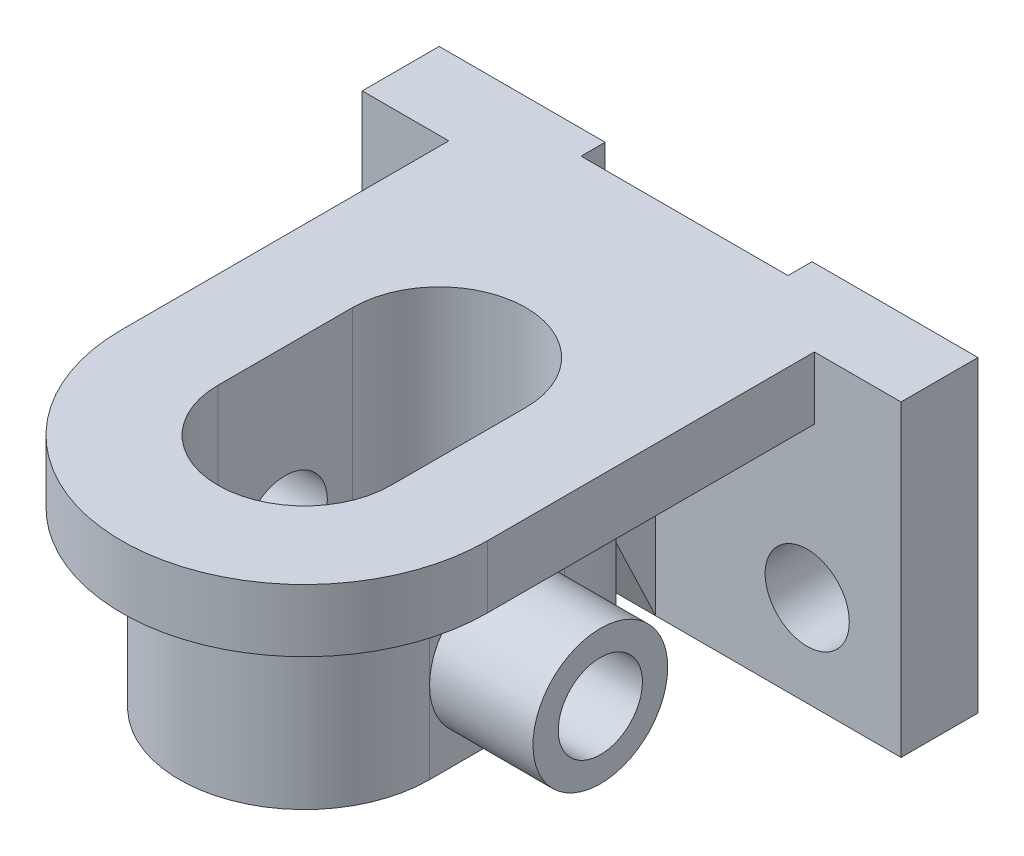
ISO-10303-21;
HEADER;
FILE_DESCRIPTION(('STEP AP214'),'2;1');
FILE_NAME('part.step','',(''),(''),'','','');
FILE_SCHEMA(('AUTOMOTIVE_DESIGN { 1 0 10303 214 1 1 1 1 }'));
ENDSEC;
DATA;
#1=APPLICATION_CONTEXT('core data for automotive mechanical design processes');
#2=APPLICATION_PROTOCOL_DEFINITION('international standard','automotive_design',2000,#1);
#3=PRODUCT_CONTEXT('',#1,'mechanical');
#4=PRODUCT('Part','Part','',(#3));
#5=PRODUCT_RELATED_PRODUCT_CATEGORY('part','',(#4));
#6=PRODUCT_DEFINITION_FORMATION('','',#4);
#7=PRODUCT_DEFINITION_CONTEXT('part definition',#1,'design');
#8=PRODUCT_DEFINITION('design','',#6,#7);
#9=PRODUCT_DEFINITION_SHAPE('','',#8);
#10=(LENGTH_UNIT() NAMED_UNIT(*) SI_UNIT(.MILLI.,.METRE.));
#11=(NAMED_UNIT(*) PLANE_ANGLE_UNIT() SI_UNIT($,.RADIAN.));
#12=(NAMED_UNIT(*) SI_UNIT($,.STERADIAN.) SOLID_ANGLE_UNIT());
#13=UNCERTAINTY_MEASURE_WITH_UNIT(LENGTH_MEASURE(1.E-05),#10,'distance_accuracy_value','');
#14=(GEOMETRIC_REPRESENTATION_CONTEXT(3) GLOBAL_UNCERTAINTY_ASSIGNED_CONTEXT((#13)) GLOBAL_UNIT_ASSIGNED_CONTEXT((#10,
#11,#12)) REPRESENTATION_CONTEXT('',''));
#15=CARTESIAN_POINT('',(0.,0.,0.));
#16=DIRECTION('',(0.,0.,1.));
#17=DIRECTION('',(1.,0.,0.));
#18=AXIS2_PLACEMENT_3D('',#15,#16,#17);
#19=CARTESIAN_POINT('',(0.,0.,32.));
#20=DIRECTION('',(0.,0.,1.));
#21=DIRECTION('',(1.,0.,0.));
#22=AXIS2_PLACEMENT_3D('',#19,#20,#21);
#23=PLANE('',#22);
#24=CARTESIAN_POINT('',(73.,-26.,32.));
#25=DIRECTION('',(0.,0.,1.));
#26=DIRECTION('',(1.,0.,0.));
#27=AXIS2_PLACEMENT_3D('',#24,#25,#26);
#28=CIRCLE('',#27,17.5);
#29=CARTESIAN_POINT('',(90.5,-26.,32.));
#30=VERTEX_POINT('',#29);
#31=EDGE_CURVE('E467',#30,#30,#28,.T.);
#32=ORIENTED_EDGE('',*,*,#31,.F.);
#33=EDGE_LOOP('',(#32));
#34=FACE_BOUND('',#33,.T.);
#35=DIRECTION('',(-1.,0.,0.));
#36=VECTOR('',#35,1.);
#37=CARTESIAN_POINT('',(76.,38.,32.));
#38=LINE('',#37,#36);
#39=CARTESIAN_POINT('',(76.,38.,32.));
#40=VERTEX_POINT('',#39);
#41=CARTESIAN_POINT('',(9.99999999999999,38.,32.));
#42=VERTEX_POINT('',#41);
#43=EDGE_CURVE('E407',#40,#42,#38,.T.);
#44=ORIENTED_EDGE('',*,*,#43,.T.);
#45=DIRECTION('',(0.,1.,0.));
#46=VECTOR('',#45,1.);
#47=CARTESIAN_POINT('',(10.,38.,32.));
#48=LINE('',#47,#46);
#49=CARTESIAN_POINT('',(9.99999999999999,-64.,32.));
#50=VERTEX_POINT('',#49);
#51=EDGE_CURVE('E252',#50,#42,#48,.T.);
#52=ORIENTED_EDGE('',*,*,#51,.F.);
#53=DIRECTION('',(1.,0.,0.));
#54=VECTOR('',#53,1.);
#55=CARTESIAN_POINT('',(112.,-64.,32.));
#56=LINE('',#55,#54);
#57=CARTESIAN_POINT('',(112.,-64.,32.));
#58=VERTEX_POINT('',#57);
#59=EDGE_CURVE('E479',#50,#58,#56,.T.);
#60=ORIENTED_EDGE('',*,*,#59,.T.);
#61=DIRECTION('',(0.,1.,0.));
#62=VECTOR('',#61,1.);
#63=CARTESIAN_POINT('',(112.,-64.,32.));
#64=LINE('',#63,#62);
#65=CARTESIAN_POINT('',(112.,64.,32.));
#66=VERTEX_POINT('',#65);
#67=EDGE_CURVE('E484',#58,#66,#64,.T.);
#68=ORIENTED_EDGE('',*,*,#67,.T.);
#69=DIRECTION('',(-1.,0.,0.));
#70=VECTOR('',#69,1.);
#71=CARTESIAN_POINT('',(112.,64.,32.));
#72=LINE('',#71,#70);
#73=CARTESIAN_POINT('',(76.,64.,32.));
#74=VERTEX_POINT('',#73);
#75=EDGE_CURVE('E488',#66,#74,#72,.T.);
#76=ORIENTED_EDGE('',*,*,#75,.T.);
#77=DIRECTION('',(0.,1.,0.));
#78=VECTOR('',#77,1.);
#79=CARTESIAN_POINT('',(76.,38.,32.));
#80=LINE('',#79,#78);
#81=EDGE_CURVE('E426',#40,#74,#80,.T.);
#82=ORIENTED_EDGE('',*,*,#81,.F.);
#83=EDGE_LOOP('',(#44,#52,#60,#68,#76,#82));
#84=FACE_BOUND('',#83,.T.);
#85=ADVANCED_FACE('F43',(#34,#84),#23,.T.);
#86=CARTESIAN_POINT('',(52.,-34.,112.));
#87=DIRECTION('',(-1.,0.,0.));
#88=DIRECTION('',(0.,-1.,0.));
#89=AXIS2_PLACEMENT_3D('',#86,#87,#88);
#90=PLANE('',#89);
#91=CARTESIAN_POINT('',(52.,0.,140.));
#92=DIRECTION('',(-1.,0.,0.));
#93=DIRECTION('',(0.,-1.,0.));
#94=AXIS2_PLACEMENT_3D('',#91,#92,#93);
#95=CIRCLE('',#94,28.);
#96=CARTESIAN_POINT('',(52.,0.,112.));
#97=VERTEX_POINT('',#96);
#98=CARTESIAN_POINT('',(52.,0.,168.));
#99=VERTEX_POINT('',#98);
#100=EDGE_CURVE('E535',#97,#99,#95,.F.);
#101=ORIENTED_EDGE('',*,*,#100,.F.);
#102=DIRECTION('',(0.,1.,0.));
#103=VECTOR('',#102,1.);
#104=CARTESIAN_POINT('',(52.,-34.,112.));
#105=LINE('',#104,#103);
#106=CARTESIAN_POINT('',(52.,38.,112.));
#107=VERTEX_POINT('',#106);
#108=EDGE_CURVE('E380',#97,#107,#105,.T.);
#109=ORIENTED_EDGE('',*,*,#108,.T.);
#110=DIRECTION('',(0.,0.,1.));
#111=VECTOR('',#110,1.);
#112=CARTESIAN_POINT('',(52.,38.,112.));
#113=LINE('',#112,#111);
#114=CARTESIAN_POINT('',(52.,38.,168.));
#115=VERTEX_POINT('',#114);
#116=EDGE_CURVE('E351',#107,#115,#113,.T.);
#117=ORIENTED_EDGE('',*,*,#116,.T.);
#118=DIRECTION('',(0.,1.,0.));
#119=VECTOR('',#118,1.);
#120=CARTESIAN_POINT('',(52.,-34.,168.));
#121=LINE('',#120,#119);
#122=EDGE_CURVE('E360',#99,#115,#121,.T.);
#123=ORIENTED_EDGE('',*,*,#122,.F.);
#124=EDGE_LOOP('',(#101,#109,#117,#123));
#125=FACE_BOUND('',#124,.T.);
#126=ADVANCED_FACE('F716',(#125),#90,.F.);
#127=CARTESIAN_POINT('',(-52.,-34.,168.));
#128=DIRECTION('',(1.,0.,0.));
#129=DIRECTION('',(0.,1.,0.));
#130=AXIS2_PLACEMENT_3D('',#127,#128,#129);
#131=PLANE('',#130);
#132=CARTESIAN_POINT('',(-52.,0.,140.));
#133=DIRECTION('',(-1.,0.,0.));
#134=DIRECTION('',(0.,-1.,0.));
#135=AXIS2_PLACEMENT_3D('',#132,#133,#134);
#136=CIRCLE('',#135,28.);
#137=CARTESIAN_POINT('',(-52.,0.,112.));
#138=VERTEX_POINT('',#137);
#139=CARTESIAN_POINT('',(-52.,0.,168.));
#140=VERTEX_POINT('',#139);
#141=EDGE_CURVE('E289',#138,#140,#136,.T.);
#142=ORIENTED_EDGE('',*,*,#141,.F.);
#143=DIRECTION('',(0.,1.,0.));
#144=VECTOR('',#143,1.);
#145=CARTESIAN_POINT('',(-52.,-34.,112.));
#146=LINE('',#145,#144);
#147=CARTESIAN_POINT('',(-52.,-34.,112.));
#148=VERTEX_POINT('',#147);
#149=EDGE_CURVE('E385',#148,#138,#146,.T.);
#150=ORIENTED_EDGE('',*,*,#149,.F.);
#151=DIRECTION('',(0.,0.,-1.));
#152=VECTOR('',#151,1.);
#153=CARTESIAN_POINT('',(-52.,-34.,168.));
#154=LINE('',#153,#152);
#155=CARTESIAN_POINT('',(-52.,-34.,168.));
#156=VERTEX_POINT('',#155);
#157=EDGE_CURVE('E350',#156,#148,#154,.T.);
#158=ORIENTED_EDGE('',*,*,#157,.F.);
#159=DIRECTION('',(0.,1.,0.));
#160=VECTOR('',#159,1.);
#161=CARTESIAN_POINT('',(-52.,-34.,168.));
#162=LINE('',#161,#160);
#163=EDGE_CURVE('E389',#156,#140,#162,.T.);
#164=ORIENTED_EDGE('',*,*,#163,.T.);
#165=EDGE_LOOP('',(#142,#150,#158,#164));
#166=FACE_BOUND('',#165,.T.);
#167=ADVANCED_FACE('F615',(#166),#131,.F.);
#168=CARTESIAN_POINT('',(0.,38.,168.));
#169=DIRECTION('',(0.,1.,0.));
#170=DIRECTION('',(-1.,0.,0.));
#171=AXIS2_PLACEMENT_3D('',#168,#169,#170);
#172=PLANE('',#171);
#173=CARTESIAN_POINT('',(-9.99999999999999,38.,32.));
#174=VERTEX_POINT('',#173);
#175=CARTESIAN_POINT('',(-76.,38.,32.));
#176=VERTEX_POINT('',#175);
#177=EDGE_CURVE('E406',#174,#176,#38,.T.);
#178=ORIENTED_EDGE('',*,*,#177,.F.);
#179=DIRECTION('',(0.,0.,1.));
#180=VECTOR('',#179,1.);
#181=CARTESIAN_POINT('',(-10.,38.,67.6370331222623));
#182=LINE('',#181,#180);
#183=CARTESIAN_POINT('',(-10.,38.,60.9705967113077));
#184=VERTEX_POINT('',#183);
#185=EDGE_CURVE('E247',#174,#184,#182,.T.);
#186=ORIENTED_EDGE('',*,*,#185,.T.);
#187=CARTESIAN_POINT('',(0.,38.,112.));
#188=DIRECTION('',(0.,-1.,0.));
#189=DIRECTION('',(1.,0.,0.));
#190=AXIS2_PLACEMENT_3D('',#187,#188,#189);
#191=CIRCLE('',#190,52.);
#192=CARTESIAN_POINT('',(-52.,38.,112.));
#193=VERTEX_POINT('',#192);
#194=EDGE_CURVE('E369',#193,#184,#191,.T.);
#195=ORIENTED_EDGE('',*,*,#194,.F.);
#196=DIRECTION('',(0.,0.,-1.));
#197=VECTOR('',#196,1.);
#198=CARTESIAN_POINT('',(-52.,38.,168.));
#199=LINE('',#198,#197);
#200=CARTESIAN_POINT('',(-52.,38.,168.));
#201=VERTEX_POINT('',#200);
#202=EDGE_CURVE('E364',#201,#193,#199,.T.);
#203=ORIENTED_EDGE('',*,*,#202,.F.);
#204=CARTESIAN_POINT('',(0.,38.,168.));
#205=DIRECTION('',(0.,-1.,0.));
#206=DIRECTION('',(-1.,0.,0.));
#207=AXIS2_PLACEMENT_3D('',#204,#205,#206);
#208=CIRCLE('',#207,52.);
#209=EDGE_CURVE('E345',#115,#201,#208,.T.);
#210=ORIENTED_EDGE('',*,*,#209,.F.);
#211=ORIENTED_EDGE('',*,*,#116,.F.);
#212=CARTESIAN_POINT('',(9.99999999999999,38.,60.9705967113077));
#213=VERTEX_POINT('',#212);
#214=EDGE_CURVE('E368',#213,#107,#191,.T.);
#215=ORIENTED_EDGE('',*,*,#214,.F.);
#216=DIRECTION('',(0.,0.,1.));
#217=VECTOR('',#216,1.);
#218=CARTESIAN_POINT('',(10.,38.,67.6370331222623));
#219=LINE('',#218,#217);
#220=EDGE_CURVE('E67',#42,#213,#219,.T.);
#221=ORIENTED_EDGE('',*,*,#220,.F.);
#222=ORIENTED_EDGE('',*,*,#43,.F.);
#223=DIRECTION('',(0.,0.,-1.));
#224=VECTOR('',#223,1.);
#225=CARTESIAN_POINT('',(76.,38.,168.));
#226=LINE('',#225,#224);
#227=CARTESIAN_POINT('',(76.,38.,168.));
#228=VERTEX_POINT('',#227);
#229=EDGE_CURVE('E403',#228,#40,#226,.T.);
#230=ORIENTED_EDGE('',*,*,#229,.F.);
#231=CARTESIAN_POINT('',(0.,38.,168.));
#232=DIRECTION('',(0.,1.,0.));
#233=DIRECTION('',(-1.,0.,0.));
#234=AXIS2_PLACEMENT_3D('',#231,#232,#233);
#235=CIRCLE('',#234,76.);
#236=CARTESIAN_POINT('',(-76.,38.,168.));
#237=VERTEX_POINT('',#236);
#238=EDGE_CURVE('E398',#237,#228,#235,.T.);
#239=ORIENTED_EDGE('',*,*,#238,.F.);
#240=DIRECTION('',(0.,0.,1.));
#241=VECTOR('',#240,1.);
#242=CARTESIAN_POINT('',(-76.,38.,168.));
#243=LINE('',#242,#241);
#244=EDGE_CURVE('E394',#176,#237,#243,.T.);
#245=ORIENTED_EDGE('',*,*,#244,.F.);
#246=EDGE_LOOP('',(#178,#186,#195,#203,#210,#211,#215,#221,#222,#230,#239,#245));
#247=FACE_BOUND('',#246,.T.);
#248=ADVANCED_FACE('F552',(#247),#172,.F.);
#249=CARTESIAN_POINT('',(0.,0.,0.));
#250=DIRECTION('',(0.,0.,1.));
#251=DIRECTION('',(1.,0.,0.));
#252=AXIS2_PLACEMENT_3D('',#249,#250,#251);
#253=PLANE('',#252);
#254=CARTESIAN_POINT('',(-73.,-26.,0.));
#255=DIRECTION('',(0.,0.,1.));
#256=DIRECTION('',(-1.,0.,0.));
#257=AXIS2_PLACEMENT_3D('',#254,#255,#256);
#258=CIRCLE('',#257,17.5);
#259=CARTESIAN_POINT('',(-90.5,-26.,0.));
#260=VERTEX_POINT('',#259);
#261=EDGE_CURVE('E458',#260,#260,#258,.T.);
#262=ORIENTED_EDGE('',*,*,#261,.T.);
#263=EDGE_LOOP('',(#262));
#264=FACE_BOUND('',#263,.T.);
#265=DIRECTION('',(-1.,0.,0.));
#266=VECTOR('',#265,1.);
#267=CARTESIAN_POINT('',(112.,64.,0.));
#268=LINE('',#267,#266);
#269=CARTESIAN_POINT('',(-43.,64.,0.));
#270=VERTEX_POINT('',#269);
#271=CARTESIAN_POINT('',(-112.,64.,0.));
#272=VERTEX_POINT('',#271);
#273=EDGE_CURVE('E504',#270,#272,#268,.T.);
#274=ORIENTED_EDGE('',*,*,#273,.F.);
#275=DIRECTION('',(0.,-1.,0.));
#276=VECTOR('',#275,1.);
#277=CARTESIAN_POINT('',(-43.,0.,0.));
#278=LINE('',#277,#276);
#279=CARTESIAN_POINT('',(-43.,-64.,0.));
#280=VERTEX_POINT('',#279);
#281=EDGE_CURVE('E454',#270,#280,#278,.T.);
#282=ORIENTED_EDGE('',*,*,#281,.T.);
#283=DIRECTION('',(1.,0.,0.));
#284=VECTOR('',#283,1.);
#285=CARTESIAN_POINT('',(112.,-64.,0.));
#286=LINE('',#285,#284);
#287=CARTESIAN_POINT('',(-112.,-64.,0.));
#288=VERTEX_POINT('',#287);
#289=EDGE_CURVE('E497',#288,#280,#286,.T.);
#290=ORIENTED_EDGE('',*,*,#289,.F.);
#291=DIRECTION('',(0.,-1.,0.));
#292=VECTOR('',#291,1.);
#293=CARTESIAN_POINT('',(-112.,-64.,0.));
#294=LINE('',#293,#292);
#295=EDGE_CURVE('E471',#272,#288,#294,.T.);
#296=ORIENTED_EDGE('',*,*,#295,.F.);
#297=EDGE_LOOP('',(#274,#282,#290,#296));
#298=FACE_BOUND('',#297,.T.);
#299=ADVANCED_FACE('F732',(#264,#298),#253,.F.);
#300=DIRECTION('',(0.,1.,0.));
#301=VECTOR('',#300,1.);
#302=CARTESIAN_POINT('',(-10.,38.,32.));
#303=LINE('',#302,#301);
#304=CARTESIAN_POINT('',(-9.99999999999999,-64.,32.));
#305=VERTEX_POINT('',#304);
#306=EDGE_CURVE('E59',#305,#174,#303,.T.);
#307=ORIENTED_EDGE('',*,*,#306,.T.);
#308=ORIENTED_EDGE('',*,*,#177,.T.);
#309=DIRECTION('',(0.,1.,0.));
#310=VECTOR('',#309,1.);
#311=CARTESIAN_POINT('',(-76.,38.,32.));
#312=LINE('',#311,#310);
#313=CARTESIAN_POINT('',(-76.,64.,32.));
#314=VERTEX_POINT('',#313);
#315=EDGE_CURVE('E421',#176,#314,#312,.T.);
#316=ORIENTED_EDGE('',*,*,#315,.T.);
#317=CARTESIAN_POINT('',(-112.,64.,32.));
#318=VERTEX_POINT('',#317);
#319=EDGE_CURVE('E487',#314,#318,#72,.T.);
#320=ORIENTED_EDGE('',*,*,#319,.T.);
#321=DIRECTION('',(0.,-1.,0.));
#322=VECTOR('',#321,1.);
#323=CARTESIAN_POINT('',(-112.,-64.,32.));
#324=LINE('',#323,#322);
#325=CARTESIAN_POINT('',(-112.,-64.,32.));
#326=VERTEX_POINT('',#325);
#327=EDGE_CURVE('E475',#318,#326,#324,.T.);
#328=ORIENTED_EDGE('',*,*,#327,.T.);
#329=EDGE_CURVE('E481',#326,#305,#56,.T.);
#330=ORIENTED_EDGE('',*,*,#329,.T.);
#331=EDGE_LOOP('',(#307,#308,#316,#320,#328,#330));
#332=FACE_BOUND('',#331,.T.);
#333=CARTESIAN_POINT('',(-73.,-26.,32.));
#334=DIRECTION('',(0.,0.,1.));
#335=DIRECTION('',(-1.,0.,0.));
#336=AXIS2_PLACEMENT_3D('',#333,#334,#335);
#337=CIRCLE('',#336,17.5);
#338=CARTESIAN_POINT('',(-90.5,-26.,32.));
#339=VERTEX_POINT('',#338);
#340=EDGE_CURVE('E459',#339,#339,#337,.T.);
#341=ORIENTED_EDGE('',*,*,#340,.F.);
#342=EDGE_LOOP('',(#341));
#343=FACE_BOUND('',#342,.T.);
#344=ADVANCED_FACE('F675',(#332,#343),#23,.T.);
#345=CARTESIAN_POINT('',(43.,-64.,0.));
#346=VERTEX_POINT('',#345);
#347=CARTESIAN_POINT('',(112.,-64.,0.));
#348=VERTEX_POINT('',#347);
#349=EDGE_CURVE('E496',#346,#348,#286,.T.);
#350=ORIENTED_EDGE('',*,*,#349,.F.);
#351=DIRECTION('',(0.,1.,0.));
#352=VECTOR('',#351,1.);
#353=CARTESIAN_POINT('',(43.,0.,0.));
#354=LINE('',#353,#352);
#355=CARTESIAN_POINT('',(43.,64.,0.));
#356=VERTEX_POINT('',#355);
#357=EDGE_CURVE('E448',#346,#356,#354,.T.);
#358=ORIENTED_EDGE('',*,*,#357,.T.);
#359=CARTESIAN_POINT('',(112.,64.,0.));
#360=VERTEX_POINT('',#359);
#361=EDGE_CURVE('E480',#360,#356,#268,.T.);
#362=ORIENTED_EDGE('',*,*,#361,.F.);
#363=DIRECTION('',(0.,1.,0.));
#364=VECTOR('',#363,1.);
#365=CARTESIAN_POINT('',(112.,-64.,0.));
#366=LINE('',#365,#364);
#367=EDGE_CURVE('E501',#348,#360,#366,.T.);
#368=ORIENTED_EDGE('',*,*,#367,.F.);
#369=EDGE_LOOP('',(#350,#358,#362,#368));
#370=FACE_BOUND('',#369,.T.);
#371=CARTESIAN_POINT('',(73.,-26.,0.));
#372=DIRECTION('',(0.,0.,1.));
#373=DIRECTION('',(1.,0.,0.));
#374=AXIS2_PLACEMENT_3D('',#371,#372,#373);
#375=CIRCLE('',#374,17.5);
#376=CARTESIAN_POINT('',(90.5,-26.,0.));
#377=VERTEX_POINT('',#376);
#378=EDGE_CURVE('E463',#377,#377,#375,.T.);
#379=ORIENTED_EDGE('',*,*,#378,.T.);
#380=EDGE_LOOP('',(#379));
#381=FACE_BOUND('',#380,.T.);
#382=ADVANCED_FACE('F731',(#370,#381),#253,.F.);
#383=CARTESIAN_POINT('',(-112.,-64.,32.));
#384=DIRECTION('',(1.,0.,0.));
#385=DIRECTION('',(0.,0.,-1.));
#386=AXIS2_PLACEMENT_3D('',#383,#384,#385);
#387=PLANE('',#386);
#388=ORIENTED_EDGE('',*,*,#295,.T.);
#389=DIRECTION('',(0.,0.,-1.));
#390=VECTOR('',#389,1.);
#391=CARTESIAN_POINT('',(-112.,-64.,32.));
#392=LINE('',#391,#390);
#393=EDGE_CURVE('E519',#326,#288,#392,.T.);
#394=ORIENTED_EDGE('',*,*,#393,.F.);
#395=ORIENTED_EDGE('',*,*,#327,.F.);
#396=DIRECTION('',(0.,0.,-1.));
#397=VECTOR('',#396,1.);
#398=CARTESIAN_POINT('',(-112.,64.,32.));
#399=LINE('',#398,#397);
#400=EDGE_CURVE('E492',#318,#272,#399,.T.);
#401=ORIENTED_EDGE('',*,*,#400,.T.);
#402=EDGE_LOOP('',(#388,#394,#395,#401));
#403=FACE_BOUND('',#402,.T.);
#404=ADVANCED_FACE('F45',(#403),#387,.F.);
#405=CARTESIAN_POINT('',(112.,-64.,32.));
#406=DIRECTION('',(0.,1.,0.));
#407=DIRECTION('',(-1.,0.,0.));
#408=AXIS2_PLACEMENT_3D('',#405,#406,#407);
#409=PLANE('',#408);
#410=ORIENTED_EDGE('',*,*,#289,.T.);
#411=DIRECTION('',(0.,0.,-1.));
#412=VECTOR('',#411,1.);
#413=CARTESIAN_POINT('',(-43.,-64.,-10.));
#414=LINE('',#413,#412);
#415=CARTESIAN_POINT('',(-43.,-64.,9.99999999999999));
#416=VERTEX_POINT('',#415);
#417=EDGE_CURVE('E425',#416,#280,#414,.T.);
#418=ORIENTED_EDGE('',*,*,#417,.F.);
#419=DIRECTION('',(-1.,0.,0.));
#420=VECTOR('',#419,1.);
#421=CARTESIAN_POINT('',(43.,-64.,10.));
#422=LINE('',#421,#420);
#423=CARTESIAN_POINT('',(43.,-64.,10.));
#424=VERTEX_POINT('',#423);
#425=EDGE_CURVE('E440',#424,#416,#422,.T.);
#426=ORIENTED_EDGE('',*,*,#425,.F.);
#427=DIRECTION('',(0.,0.,1.));
#428=VECTOR('',#427,1.);
#429=CARTESIAN_POINT('',(43.,-64.,-10.));
#430=LINE('',#429,#428);
#431=EDGE_CURVE('E436',#346,#424,#430,.T.);
#432=ORIENTED_EDGE('',*,*,#431,.F.);
#433=ORIENTED_EDGE('',*,*,#349,.T.);
#434=DIRECTION('',(0.,0.,-1.));
#435=VECTOR('',#434,1.);
#436=CARTESIAN_POINT('',(112.,-64.,32.));
#437=LINE('',#436,#435);
#438=EDGE_CURVE('E515',#58,#348,#437,.T.);
#439=ORIENTED_EDGE('',*,*,#438,.F.);
#440=ORIENTED_EDGE('',*,*,#59,.F.);
#441=DIRECTION('',(1.,0.,0.));
#442=VECTOR('',#441,1.);
#443=CARTESIAN_POINT('',(-10.,-64.,32.));
#444=LINE('',#443,#442);
#445=EDGE_CURVE('E246',#305,#50,#444,.T.);
#446=ORIENTED_EDGE('',*,*,#445,.F.);
#447=ORIENTED_EDGE('',*,*,#329,.F.);
#448=ORIENTED_EDGE('',*,*,#393,.T.);
#449=EDGE_LOOP('',(#410,#418,#426,#432,#433,#439,#440,#446,#447,#448));
#450=FACE_BOUND('',#449,.T.);
#451=ADVANCED_FACE('F686',(#450),#409,.F.);
#452=CARTESIAN_POINT('',(112.,-64.,32.));
#453=DIRECTION('',(-1.,0.,0.));
#454=DIRECTION('',(0.,0.,1.));
#455=AXIS2_PLACEMENT_3D('',#452,#453,#454);
#456=PLANE('',#455);
#457=ORIENTED_EDGE('',*,*,#367,.T.);
#458=DIRECTION('',(0.,0.,-1.));
#459=VECTOR('',#458,1.);
#460=CARTESIAN_POINT('',(112.,64.,32.));
#461=LINE('',#460,#459);
#462=EDGE_CURVE('E511',#66,#360,#461,.T.);
#463=ORIENTED_EDGE('',*,*,#462,.F.);
#464=ORIENTED_EDGE('',*,*,#67,.F.);
#465=ORIENTED_EDGE('',*,*,#438,.T.);
#466=EDGE_LOOP('',(#457,#463,#464,#465));
#467=FACE_BOUND('',#466,.T.);
#468=ADVANCED_FACE('F748',(#467),#456,.F.);
#469=CARTESIAN_POINT('',(112.,64.,32.));
#470=DIRECTION('',(0.,-1.,0.));
#471=DIRECTION('',(1.,0.,0.));
#472=AXIS2_PLACEMENT_3D('',#469,#470,#471);
#473=PLANE('',#472);
#474=DIRECTION('',(0.,0.,1.));
#475=VECTOR('',#474,1.);
#476=CARTESIAN_POINT('',(36.,64.,32.));
#477=LINE('',#476,#475);
#478=CARTESIAN_POINT('',(36.,64.,112.));
#479=VERTEX_POINT('',#478);
#480=CARTESIAN_POINT('',(36.,64.,168.));
#481=VERTEX_POINT('',#480);
#482=EDGE_CURVE('E337',#479,#481,#477,.T.);
#483=ORIENTED_EDGE('',*,*,#482,.T.);
#484=CARTESIAN_POINT('',(0.,64.,168.));
#485=DIRECTION('',(0.,-1.,0.));
#486=DIRECTION('',(1.,0.,0.));
#487=AXIS2_PLACEMENT_3D('',#484,#485,#486);
#488=CIRCLE('',#487,36.);
#489=CARTESIAN_POINT('',(-36.,64.,168.));
#490=VERTEX_POINT('',#489);
#491=EDGE_CURVE('E341',#481,#490,#488,.T.);
#492=ORIENTED_EDGE('',*,*,#491,.T.);
#493=DIRECTION('',(0.,0.,-1.));
#494=VECTOR('',#493,1.);
#495=CARTESIAN_POINT('',(-36.,64.,32.));
#496=LINE('',#495,#494);
#497=CARTESIAN_POINT('',(-36.,64.,112.));
#498=VERTEX_POINT('',#497);
#499=EDGE_CURVE('E320',#490,#498,#496,.T.);
#500=ORIENTED_EDGE('',*,*,#499,.T.);
#501=CARTESIAN_POINT('',(0.,64.,112.));
#502=DIRECTION('',(0.,-1.,0.));
#503=DIRECTION('',(1.,0.,0.));
#504=AXIS2_PLACEMENT_3D('',#501,#502,#503);
#505=CIRCLE('',#504,36.);
#506=EDGE_CURVE('E333',#498,#479,#505,.T.);
#507=ORIENTED_EDGE('',*,*,#506,.T.);
#508=EDGE_LOOP('',(#483,#492,#500,#507));
#509=FACE_BOUND('',#508,.T.);
#510=DIRECTION('',(-1.,0.,0.));
#511=VECTOR('',#510,1.);
#512=CARTESIAN_POINT('',(112.,64.,10.));
#513=LINE('',#512,#511);
#514=CARTESIAN_POINT('',(43.,64.,10.));
#515=VERTEX_POINT('',#514);
#516=CARTESIAN_POINT('',(-43.,64.,9.99999999999999));
#517=VERTEX_POINT('',#516);
#518=EDGE_CURVE('E527',#515,#517,#513,.T.);
#519=ORIENTED_EDGE('',*,*,#518,.T.);
#520=DIRECTION('',(0.,0.,-1.));
#521=VECTOR('',#520,1.);
#522=CARTESIAN_POINT('',(-43.,64.,32.));
#523=LINE('',#522,#521);
#524=EDGE_CURVE('E531',#517,#270,#523,.T.);
#525=ORIENTED_EDGE('',*,*,#524,.T.);
#526=ORIENTED_EDGE('',*,*,#273,.T.);
#527=ORIENTED_EDGE('',*,*,#400,.F.);
#528=ORIENTED_EDGE('',*,*,#319,.F.);
#529=DIRECTION('',(0.,0.,1.));
#530=VECTOR('',#529,1.);
#531=CARTESIAN_POINT('',(-76.,64.,168.));
#532=LINE('',#531,#530);
#533=CARTESIAN_POINT('',(-76.,64.,168.));
#534=VERTEX_POINT('',#533);
#535=EDGE_CURVE('E393',#314,#534,#532,.T.);
#536=ORIENTED_EDGE('',*,*,#535,.T.);
#537=CARTESIAN_POINT('',(0.,64.,168.));
#538=DIRECTION('',(0.,1.,0.));
#539=DIRECTION('',(-1.,0.,0.));
#540=AXIS2_PLACEMENT_3D('',#537,#538,#539);
#541=CIRCLE('',#540,76.);
#542=CARTESIAN_POINT('',(76.,64.,168.));
#543=VERTEX_POINT('',#542);
#544=EDGE_CURVE('E414',#534,#543,#541,.T.);
#545=ORIENTED_EDGE('',*,*,#544,.T.);
#546=DIRECTION('',(0.,0.,-1.));
#547=VECTOR('',#546,1.);
#548=CARTESIAN_POINT('',(76.,64.,168.));
#549=LINE('',#548,#547);
#550=EDGE_CURVE('E399',#543,#74,#549,.T.);
#551=ORIENTED_EDGE('',*,*,#550,.T.);
#552=ORIENTED_EDGE('',*,*,#75,.F.);
#553=ORIENTED_EDGE('',*,*,#462,.T.);
#554=ORIENTED_EDGE('',*,*,#361,.T.);
#555=DIRECTION('',(0.,0.,1.));
#556=VECTOR('',#555,1.);
#557=CARTESIAN_POINT('',(43.,64.,32.));
#558=LINE('',#557,#556);
#559=EDGE_CURVE('E523',#356,#515,#558,.T.);
#560=ORIENTED_EDGE('',*,*,#559,.T.);
#561=EDGE_LOOP('',(#519,#525,#526,#527,#528,#536,#545,#551,#552,#553,#554,#560));
#562=FACE_BOUND('',#561,.T.);
#563=ADVANCED_FACE('F681',(#509,#562),#473,.F.);
#564=CARTESIAN_POINT('',(73.,-26.,32.));
#565=DIRECTION('',(0.,0.,-1.));
#566=DIRECTION('',(-1.,0.,0.));
#567=AXIS2_PLACEMENT_3D('',#564,#565,#566);
#568=CYLINDRICAL_SURFACE('',#567,17.5);
#569=ORIENTED_EDGE('',*,*,#31,.T.);
#570=EDGE_LOOP('',(#569));
#571=FACE_BOUND('',#570,.T.);
#572=ORIENTED_EDGE('',*,*,#378,.F.);
#573=EDGE_LOOP('',(#572));
#574=FACE_BOUND('',#573,.T.);
#575=ADVANCED_FACE('F747',(#571,#574),#568,.F.);
#576=CARTESIAN_POINT('',(-73.,-26.,32.));
#577=DIRECTION('',(0.,0.,-1.));
#578=DIRECTION('',(-1.,0.,0.));
#579=AXIS2_PLACEMENT_3D('',#576,#577,#578);
#580=CYLINDRICAL_SURFACE('',#579,17.5);
#581=ORIENTED_EDGE('',*,*,#340,.T.);
#582=EDGE_LOOP('',(#581));
#583=FACE_BOUND('',#582,.T.);
#584=ORIENTED_EDGE('',*,*,#261,.F.);
#585=EDGE_LOOP('',(#584));
#586=FACE_BOUND('',#585,.T.);
#587=ADVANCED_FACE('F771',(#583,#586),#580,.F.);
#588=CARTESIAN_POINT('',(-43.,81.,-10.));
#589=DIRECTION('',(-1.,0.,0.));
#590=DIRECTION('',(0.,-1.,0.));
#591=AXIS2_PLACEMENT_3D('',#588,#589,#590);
#592=PLANE('',#591);
#593=ORIENTED_EDGE('',*,*,#524,.F.);
#594=DIRECTION('',(0.,-1.,0.));
#595=VECTOR('',#594,1.);
#596=CARTESIAN_POINT('',(-43.,81.,9.99999999999999));
#597=LINE('',#596,#595);
#598=EDGE_CURVE('E445',#517,#416,#597,.T.);
#599=ORIENTED_EDGE('',*,*,#598,.T.);
#600=ORIENTED_EDGE('',*,*,#417,.T.);
#601=ORIENTED_EDGE('',*,*,#281,.F.);
#602=EDGE_LOOP('',(#593,#599,#600,#601));
#603=FACE_BOUND('',#602,.T.);
#604=ADVANCED_FACE('F778',(#603),#592,.F.);
#605=CARTESIAN_POINT('',(43.,81.,10.));
#606=DIRECTION('',(0.,0.,1.));
#607=DIRECTION('',(1.,0.,0.));
#608=AXIS2_PLACEMENT_3D('',#605,#606,#607);
#609=PLANE('',#608);
#610=DIRECTION('',(0.,-1.,0.));
#611=VECTOR('',#610,1.);
#612=CARTESIAN_POINT('',(43.,81.,10.));
#613=LINE('',#612,#611);
#614=EDGE_CURVE('E444',#515,#424,#613,.T.);
#615=ORIENTED_EDGE('',*,*,#614,.T.);
#616=ORIENTED_EDGE('',*,*,#425,.T.);
#617=ORIENTED_EDGE('',*,*,#598,.F.);
#618=ORIENTED_EDGE('',*,*,#518,.F.);
#619=EDGE_LOOP('',(#615,#616,#617,#618));
#620=FACE_BOUND('',#619,.T.);
#621=ADVANCED_FACE('F795',(#620),#609,.F.);
#622=CARTESIAN_POINT('',(43.,81.,-10.));
#623=DIRECTION('',(1.,0.,0.));
#624=DIRECTION('',(0.,1.,0.));
#625=AXIS2_PLACEMENT_3D('',#622,#623,#624);
#626=PLANE('',#625);
#627=ORIENTED_EDGE('',*,*,#431,.T.);
#628=ORIENTED_EDGE('',*,*,#614,.F.);
#629=ORIENTED_EDGE('',*,*,#559,.F.);
#630=ORIENTED_EDGE('',*,*,#357,.F.);
#631=EDGE_LOOP('',(#627,#628,#629,#630));
#632=FACE_BOUND('',#631,.T.);
#633=ADVANCED_FACE('F712',(#632),#626,.F.);
#634=CARTESIAN_POINT('',(-76.,38.,168.));
#635=DIRECTION('',(-1.,0.,0.));
#636=DIRECTION('',(0.,-1.,0.));
#637=AXIS2_PLACEMENT_3D('',#634,#635,#636);
#638=PLANE('',#637);
#639=ORIENTED_EDGE('',*,*,#535,.F.);
#640=ORIENTED_EDGE('',*,*,#315,.F.);
#641=ORIENTED_EDGE('',*,*,#244,.T.);
#642=DIRECTION('',(0.,1.,0.));
#643=VECTOR('',#642,1.);
#644=CARTESIAN_POINT('',(-76.,38.,168.));
#645=LINE('',#644,#643);
#646=EDGE_CURVE('E410',#237,#534,#645,.T.);
#647=ORIENTED_EDGE('',*,*,#646,.T.);
#648=EDGE_LOOP('',(#639,#640,#641,#647));
#649=FACE_BOUND('',#648,.T.);
#650=ADVANCED_FACE('F702',(#649),#638,.T.);
#651=CARTESIAN_POINT('',(76.,38.,168.));
#652=DIRECTION('',(1.,0.,0.));
#653=DIRECTION('',(0.,1.,0.));
#654=AXIS2_PLACEMENT_3D('',#651,#652,#653);
#655=PLANE('',#654);
#656=ORIENTED_EDGE('',*,*,#550,.F.);
#657=DIRECTION('',(0.,1.,0.));
#658=VECTOR('',#657,1.);
#659=CARTESIAN_POINT('',(76.,38.,168.));
#660=LINE('',#659,#658);
#661=EDGE_CURVE('E429',#228,#543,#660,.T.);
#662=ORIENTED_EDGE('',*,*,#661,.F.);
#663=ORIENTED_EDGE('',*,*,#229,.T.);
#664=ORIENTED_EDGE('',*,*,#81,.T.);
#665=EDGE_LOOP('',(#656,#662,#663,#664));
#666=FACE_BOUND('',#665,.T.);
#667=ADVANCED_FACE('F704',(#666),#655,.T.);
#668=CARTESIAN_POINT('',(0.,38.,168.));
#669=DIRECTION('',(0.,1.,0.));
#670=DIRECTION('',(-1.,0.,0.));
#671=AXIS2_PLACEMENT_3D('',#668,#669,#670);
#672=CYLINDRICAL_SURFACE('',#671,76.);
#673=ORIENTED_EDGE('',*,*,#544,.F.);
#674=ORIENTED_EDGE('',*,*,#646,.F.);
#675=ORIENTED_EDGE('',*,*,#238,.T.);
#676=ORIENTED_EDGE('',*,*,#661,.T.);
#677=EDGE_LOOP('',(#673,#674,#675,#676));
#678=FACE_BOUND('',#677,.T.);
#679=ADVANCED_FACE('F699',(#678),#672,.T.);
#680=CARTESIAN_POINT('',(0.,-34.,168.));
#681=DIRECTION('',(0.,1.,0.));
#682=DIRECTION('',(-1.,0.,0.));
#683=AXIS2_PLACEMENT_3D('',#680,#681,#682);
#684=CYLINDRICAL_SURFACE('',#683,52.);
#685=ORIENTED_EDGE('',*,*,#209,.T.);
#686=EDGE_CURVE('E388',#140,#201,#162,.T.);
#687=ORIENTED_EDGE('',*,*,#686,.F.);
#688=ORIENTED_EDGE('',*,*,#163,.F.);
#689=CARTESIAN_POINT('',(0.,-34.,168.));
#690=DIRECTION('',(0.,-1.,0.));
#691=DIRECTION('',(-1.,0.,0.));
#692=AXIS2_PLACEMENT_3D('',#689,#690,#691);
#693=CIRCLE('',#692,52.);
#694=CARTESIAN_POINT('',(52.,-34.,168.));
#695=VERTEX_POINT('',#694);
#696=EDGE_CURVE('E346',#695,#156,#693,.T.);
#697=ORIENTED_EDGE('',*,*,#696,.F.);
#698=EDGE_CURVE('E376',#695,#99,#121,.T.);
#699=ORIENTED_EDGE('',*,*,#698,.T.);
#700=ORIENTED_EDGE('',*,*,#122,.T.);
#701=EDGE_LOOP('',(#685,#687,#688,#697,#699,#700));
#702=FACE_BOUND('',#701,.T.);
#703=ADVANCED_FACE('F620',(#702),#684,.T.);
#704=EDGE_CURVE('E298',#140,#138,#136,.T.);
#705=ORIENTED_EDGE('',*,*,#704,.F.);
#706=ORIENTED_EDGE('',*,*,#686,.T.);
#707=ORIENTED_EDGE('',*,*,#202,.T.);
#708=EDGE_CURVE('E384',#138,#193,#146,.T.);
#709=ORIENTED_EDGE('',*,*,#708,.F.);
#710=EDGE_LOOP('',(#705,#706,#707,#709));
#711=FACE_BOUND('',#710,.T.);
#712=ADVANCED_FACE('F852',(#711),#131,.F.);
#713=CARTESIAN_POINT('',(0.,-34.,112.));
#714=DIRECTION('',(0.,1.,0.));
#715=DIRECTION('',(-1.,0.,0.));
#716=AXIS2_PLACEMENT_3D('',#713,#714,#715);
#717=CYLINDRICAL_SURFACE('',#716,52.);
#718=ORIENTED_EDGE('',*,*,#194,.T.);
#719=DIRECTION('',(0.,1.,0.));
#720=VECTOR('',#719,1.);
#721=CARTESIAN_POINT('',(-10.,-34.,60.9705967113077));
#722=LINE('',#721,#720);
#723=CARTESIAN_POINT('',(-10.,-22.,60.9705967113077));
#724=VERTEX_POINT('',#723);
#725=EDGE_CURVE('E11',#184,#724,#722,.F.);
#726=ORIENTED_EDGE('',*,*,#725,.T.);
#727=CARTESIAN_POINT('',(0.,-22.,112.));
#728=DIRECTION('',(0.,-1.,0.));
#729=DIRECTION('',(0.,0.,-1.));
#730=AXIS2_PLACEMENT_3D('',#727,#728,#729);
#731=CIRCLE('',#730,52.);
#732=CARTESIAN_POINT('',(10.,-22.,60.9705967113077));
#733=VERTEX_POINT('',#732);
#734=EDGE_CURVE('E52',#724,#733,#731,.T.);
#735=ORIENTED_EDGE('',*,*,#734,.T.);
#736=DIRECTION('',(0.,1.,0.));
#737=VECTOR('',#736,1.);
#738=CARTESIAN_POINT('',(10.,-34.,60.9705967113077));
#739=LINE('',#738,#737);
#740=EDGE_CURVE('E232',#213,#733,#739,.F.);
#741=ORIENTED_EDGE('',*,*,#740,.F.);
#742=ORIENTED_EDGE('',*,*,#214,.T.);
#743=ORIENTED_EDGE('',*,*,#108,.F.);
#744=CARTESIAN_POINT('',(52.,-34.,112.));
#745=VERTEX_POINT('',#744);
#746=EDGE_CURVE('E381',#745,#97,#105,.T.);
#747=ORIENTED_EDGE('',*,*,#746,.F.);
#748=CARTESIAN_POINT('',(0.,-34.,112.));
#749=DIRECTION('',(0.,-1.,0.));
#750=DIRECTION('',(1.,0.,0.));
#751=AXIS2_PLACEMENT_3D('',#748,#749,#750);
#752=CIRCLE('',#751,52.);
#753=EDGE_CURVE('E354',#148,#745,#752,.T.);
#754=ORIENTED_EDGE('',*,*,#753,.F.);
#755=ORIENTED_EDGE('',*,*,#149,.T.);
#756=ORIENTED_EDGE('',*,*,#708,.T.);
#757=EDGE_LOOP('',(#718,#726,#735,#741,#742,#743,#747,#754,#755,#756));
#758=FACE_BOUND('',#757,.T.);
#759=ADVANCED_FACE('F546',(#758),#717,.T.);
#760=CARTESIAN_POINT('',(52.,0.,140.));
#761=DIRECTION('',(1.,0.,0.));
#762=DIRECTION('',(0.,1.,0.));
#763=AXIS2_PLACEMENT_3D('',#760,#761,#762);
#764=CIRCLE('',#763,28.);
#765=EDGE_CURVE('E284',#99,#97,#764,.T.);
#766=ORIENTED_EDGE('',*,*,#765,.F.);
#767=ORIENTED_EDGE('',*,*,#698,.F.);
#768=DIRECTION('',(0.,0.,1.));
#769=VECTOR('',#768,1.);
#770=CARTESIAN_POINT('',(52.,-34.,112.));
#771=LINE('',#770,#769);
#772=EDGE_CURVE('E357',#745,#695,#771,.T.);
#773=ORIENTED_EDGE('',*,*,#772,.F.);
#774=ORIENTED_EDGE('',*,*,#746,.T.);
#775=EDGE_LOOP('',(#766,#767,#773,#774));
#776=FACE_BOUND('',#775,.T.);
#777=ADVANCED_FACE('F726',(#776),#90,.F.);
#778=CARTESIAN_POINT('',(0.,-34.,168.));
#779=DIRECTION('',(0.,1.,0.));
#780=DIRECTION('',(-1.,0.,0.));
#781=AXIS2_PLACEMENT_3D('',#778,#779,#780);
#782=PLANE('',#781);
#783=DIRECTION('',(0.,0.,-1.));
#784=VECTOR('',#783,1.);
#785=CARTESIAN_POINT('',(-36.,-34.,168.));
#786=LINE('',#785,#784);
#787=CARTESIAN_POINT('',(-36.,-34.,168.));
#788=VERTEX_POINT('',#787);
#789=CARTESIAN_POINT('',(-36.,-34.,112.));
#790=VERTEX_POINT('',#789);
#791=EDGE_CURVE('E304',#788,#790,#786,.T.);
#792=ORIENTED_EDGE('',*,*,#791,.F.);
#793=CARTESIAN_POINT('',(0.,-34.,168.));
#794=DIRECTION('',(0.,-1.,0.));
#795=DIRECTION('',(-1.,0.,0.));
#796=AXIS2_PLACEMENT_3D('',#793,#794,#795);
#797=CIRCLE('',#796,36.);
#798=CARTESIAN_POINT('',(36.,-34.,168.));
#799=VERTEX_POINT('',#798);
#800=EDGE_CURVE('E297',#799,#788,#797,.T.);
#801=ORIENTED_EDGE('',*,*,#800,.F.);
#802=DIRECTION('',(0.,0.,1.));
#803=VECTOR('',#802,1.);
#804=CARTESIAN_POINT('',(36.,-34.,112.));
#805=LINE('',#804,#803);
#806=CARTESIAN_POINT('',(36.,-34.,112.));
#807=VERTEX_POINT('',#806);
#808=EDGE_CURVE('E312',#807,#799,#805,.T.);
#809=ORIENTED_EDGE('',*,*,#808,.F.);
#810=CARTESIAN_POINT('',(0.,-34.,112.));
#811=DIRECTION('',(0.,-1.,0.));
#812=DIRECTION('',(1.,0.,0.));
#813=AXIS2_PLACEMENT_3D('',#810,#811,#812);
#814=CIRCLE('',#813,36.);
#815=EDGE_CURVE('E308',#790,#807,#814,.T.);
#816=ORIENTED_EDGE('',*,*,#815,.F.);
#817=EDGE_LOOP('',(#792,#801,#809,#816));
#818=FACE_BOUND('',#817,.T.);
#819=ORIENTED_EDGE('',*,*,#696,.T.);
#820=ORIENTED_EDGE('',*,*,#157,.T.);
#821=ORIENTED_EDGE('',*,*,#753,.T.);
#822=ORIENTED_EDGE('',*,*,#772,.T.);
#823=EDGE_LOOP('',(#819,#820,#821,#822));
#824=FACE_BOUND('',#823,.T.);
#825=ADVANCED_FACE('F879',(#818,#824),#782,.F.);
#826=CARTESIAN_POINT('',(0.,97.0000000000001,168.));
#827=DIRECTION('',(0.,-1.,0.));
#828=DIRECTION('',(1.,0.,0.));
#829=AXIS2_PLACEMENT_3D('',#826,#827,#828);
#830=CYLINDRICAL_SURFACE('',#829,36.);
#831=DIRECTION('',(0.,-1.,0.));
#832=VECTOR('',#831,1.);
#833=CARTESIAN_POINT('',(36.,97.0000000000001,168.));
#834=LINE('',#833,#832);
#835=EDGE_CURVE('E317',#481,#799,#834,.T.);
#836=ORIENTED_EDGE('',*,*,#835,.T.);
#837=ORIENTED_EDGE('',*,*,#800,.T.);
#838=DIRECTION('',(0.,-1.,0.));
#839=VECTOR('',#838,1.);
#840=CARTESIAN_POINT('',(-36.,97.0000000000001,168.));
#841=LINE('',#840,#839);
#842=EDGE_CURVE('E316',#490,#788,#841,.T.);
#843=ORIENTED_EDGE('',*,*,#842,.F.);
#844=ORIENTED_EDGE('',*,*,#491,.F.);
#845=EDGE_LOOP('',(#836,#837,#843,#844));
#846=FACE_BOUND('',#845,.T.);
#847=ADVANCED_FACE('F888',(#846),#830,.F.);
#848=CARTESIAN_POINT('',(36.,97.0000000000001,112.));
#849=DIRECTION('',(1.,0.,0.));
#850=DIRECTION('',(0.,1.,0.));
#851=AXIS2_PLACEMENT_3D('',#848,#849,#850);
#852=PLANE('',#851);
#853=CARTESIAN_POINT('',(36.,0.,140.));
#854=DIRECTION('',(1.,0.,0.));
#855=DIRECTION('',(0.,1.,0.));
#856=AXIS2_PLACEMENT_3D('',#853,#854,#855);
#857=CIRCLE('',#856,17.5);
#858=CARTESIAN_POINT('',(36.,17.5,140.));
#859=VERTEX_POINT('',#858);
#860=EDGE_CURVE('E280',#859,#859,#857,.T.);
#861=ORIENTED_EDGE('',*,*,#860,.T.);
#862=EDGE_LOOP('',(#861));
#863=FACE_BOUND('',#862,.T.);
#864=DIRECTION('',(0.,-1.,0.));
#865=VECTOR('',#864,1.);
#866=CARTESIAN_POINT('',(36.,97.0000000000001,112.));
#867=LINE('',#866,#865);
#868=EDGE_CURVE('E321',#479,#807,#867,.T.);
#869=ORIENTED_EDGE('',*,*,#868,.T.);
#870=ORIENTED_EDGE('',*,*,#808,.T.);
#871=ORIENTED_EDGE('',*,*,#835,.F.);
#872=ORIENTED_EDGE('',*,*,#482,.F.);
#873=EDGE_LOOP('',(#869,#870,#871,#872));
#874=FACE_BOUND('',#873,.T.);
#875=ADVANCED_FACE('F898',(#863,#874),#852,.F.);
#876=CARTESIAN_POINT('',(0.,97.0000000000001,112.));
#877=DIRECTION('',(0.,-1.,0.));
#878=DIRECTION('',(1.,0.,0.));
#879=AXIS2_PLACEMENT_3D('',#876,#877,#878);
#880=CYLINDRICAL_SURFACE('',#879,36.);
#881=DIRECTION('',(0.,-1.,0.));
#882=VECTOR('',#881,1.);
#883=CARTESIAN_POINT('',(-36.,97.0000000000001,112.));
#884=LINE('',#883,#882);
#885=EDGE_CURVE('E324',#498,#790,#884,.T.);
#886=ORIENTED_EDGE('',*,*,#885,.T.);
#887=ORIENTED_EDGE('',*,*,#815,.T.);
#888=ORIENTED_EDGE('',*,*,#868,.F.);
#889=ORIENTED_EDGE('',*,*,#506,.F.);
#890=EDGE_LOOP('',(#886,#887,#888,#889));
#891=FACE_BOUND('',#890,.T.);
#892=ADVANCED_FACE('F909',(#891),#880,.F.);
#893=CARTESIAN_POINT('',(-36.,97.0000000000001,168.));
#894=DIRECTION('',(-1.,0.,0.));
#895=DIRECTION('',(0.,-1.,0.));
#896=AXIS2_PLACEMENT_3D('',#893,#894,#895);
#897=PLANE('',#896);
#898=CARTESIAN_POINT('',(-36.,0.,140.));
#899=DIRECTION('',(-1.,0.,0.));
#900=DIRECTION('',(0.,-1.,0.));
#901=AXIS2_PLACEMENT_3D('',#898,#899,#900);
#902=CIRCLE('',#901,17.5);
#903=CARTESIAN_POINT('',(-36.,-17.5,140.));
#904=VERTEX_POINT('',#903);
#905=EDGE_CURVE('E276',#904,#904,#902,.T.);
#906=ORIENTED_EDGE('',*,*,#905,.T.);
#907=EDGE_LOOP('',(#906));
#908=FACE_BOUND('',#907,.T.);
#909=ORIENTED_EDGE('',*,*,#842,.T.);
#910=ORIENTED_EDGE('',*,*,#791,.T.);
#911=ORIENTED_EDGE('',*,*,#885,.F.);
#912=ORIENTED_EDGE('',*,*,#499,.F.);
#913=EDGE_LOOP('',(#909,#910,#911,#912));
#914=FACE_BOUND('',#913,.T.);
#915=ADVANCED_FACE('F919',(#908,#914),#897,.F.);
#916=CARTESIAN_POINT('',(-95.,0.,140.));
#917=DIRECTION('',(1.,0.,0.));
#918=DIRECTION('',(0.,1.,0.));
#919=AXIS2_PLACEMENT_3D('',#916,#917,#918);
#920=CYLINDRICAL_SURFACE('',#919,28.);
#921=CARTESIAN_POINT('',(-95.,0.,140.));
#922=DIRECTION('',(-1.,0.,0.));
#923=DIRECTION('',(0.,-1.,0.));
#924=AXIS2_PLACEMENT_3D('',#921,#922,#923);
#925=CIRCLE('',#924,28.);
#926=CARTESIAN_POINT('',(-95.,-28.,140.));
#927=VERTEX_POINT('',#926);
#928=EDGE_CURVE('E293',#927,#927,#925,.T.);
#929=ORIENTED_EDGE('',*,*,#928,.F.);
#930=EDGE_LOOP('',(#929));
#931=FACE_BOUND('',#930,.T.);
#932=ORIENTED_EDGE('',*,*,#704,.T.);
#933=ORIENTED_EDGE('',*,*,#141,.T.);
#934=EDGE_LOOP('',(#932,#933));
#935=FACE_BOUND('',#934,.T.);
#936=ADVANCED_FACE('F613',(#931,#935),#920,.T.);
#937=CARTESIAN_POINT('',(-95.,0.,140.));
#938=DIRECTION('',(-1.,0.,0.));
#939=DIRECTION('',(0.,-1.,0.));
#940=AXIS2_PLACEMENT_3D('',#937,#938,#939);
#941=PLANE('',#940);
#942=CARTESIAN_POINT('',(-95.,0.,140.));
#943=DIRECTION('',(-1.,0.,0.));
#944=DIRECTION('',(0.,-1.,0.));
#945=AXIS2_PLACEMENT_3D('',#942,#943,#944);
#946=CIRCLE('',#945,17.5);
#947=CARTESIAN_POINT('',(-95.,-17.5,140.));
#948=VERTEX_POINT('',#947);
#949=EDGE_CURVE('E270',#948,#948,#946,.T.);
#950=ORIENTED_EDGE('',*,*,#949,.F.);
#951=EDGE_LOOP('',(#950));
#952=FACE_BOUND('',#951,.T.);
#953=ORIENTED_EDGE('',*,*,#928,.T.);
#954=EDGE_LOOP('',(#953));
#955=FACE_BOUND('',#954,.T.);
#956=ADVANCED_FACE('F942',(#952,#955),#941,.T.);
#957=CARTESIAN_POINT('',(95.,0.,140.));
#958=DIRECTION('',(-1.,0.,0.));
#959=DIRECTION('',(0.,-1.,0.));
#960=AXIS2_PLACEMENT_3D('',#957,#958,#959);
#961=CYLINDRICAL_SURFACE('',#960,28.);
#962=CARTESIAN_POINT('',(95.,0.,140.));
#963=DIRECTION('',(1.,0.,0.));
#964=DIRECTION('',(0.,1.,0.));
#965=AXIS2_PLACEMENT_3D('',#962,#963,#964);
#966=CIRCLE('',#965,28.);
#967=CARTESIAN_POINT('',(95.,28.,140.));
#968=VERTEX_POINT('',#967);
#969=EDGE_CURVE('E285',#968,#968,#966,.T.);
#970=ORIENTED_EDGE('',*,*,#969,.F.);
#971=EDGE_LOOP('',(#970));
#972=FACE_BOUND('',#971,.T.);
#973=ORIENTED_EDGE('',*,*,#765,.T.);
#974=ORIENTED_EDGE('',*,*,#100,.T.);
#975=EDGE_LOOP('',(#973,#974));
#976=FACE_BOUND('',#975,.T.);
#977=ADVANCED_FACE('F951',(#972,#976),#961,.T.);
#978=CARTESIAN_POINT('',(95.,0.,140.));
#979=DIRECTION('',(1.,0.,0.));
#980=DIRECTION('',(0.,1.,0.));
#981=AXIS2_PLACEMENT_3D('',#978,#979,#980);
#982=PLANE('',#981);
#983=CARTESIAN_POINT('',(95.,0.,140.));
#984=DIRECTION('',(1.,0.,0.));
#985=DIRECTION('',(0.,1.,0.));
#986=AXIS2_PLACEMENT_3D('',#983,#984,#985);
#987=CIRCLE('',#986,17.5);
#988=CARTESIAN_POINT('',(95.,17.5,140.));
#989=VERTEX_POINT('',#988);
#990=EDGE_CURVE('E275',#989,#989,#987,.T.);
#991=ORIENTED_EDGE('',*,*,#990,.F.);
#992=EDGE_LOOP('',(#991));
#993=FACE_BOUND('',#992,.T.);
#994=ORIENTED_EDGE('',*,*,#969,.T.);
#995=EDGE_LOOP('',(#994));
#996=FACE_BOUND('',#995,.T.);
#997=ADVANCED_FACE('F966',(#993,#996),#982,.T.);
#998=CARTESIAN_POINT('',(146.,0.,140.));
#999=DIRECTION('',(-1.,0.,0.));
#1000=DIRECTION('',(0.,-1.,0.));
#1001=AXIS2_PLACEMENT_3D('',#998,#999,#1000);
#1002=CYLINDRICAL_SURFACE('',#1001,17.5);
#1003=ORIENTED_EDGE('',*,*,#990,.T.);
#1004=EDGE_LOOP('',(#1003));
#1005=FACE_BOUND('',#1004,.T.);
#1006=ORIENTED_EDGE('',*,*,#860,.F.);
#1007=EDGE_LOOP('',(#1006));
#1008=FACE_BOUND('',#1007,.T.);
#1009=ADVANCED_FACE('F975',(#1005,#1008),#1002,.F.);
#1010=ORIENTED_EDGE('',*,*,#949,.T.);
#1011=EDGE_LOOP('',(#1010));
#1012=FACE_BOUND('',#1011,.T.);
#1013=ORIENTED_EDGE('',*,*,#905,.F.);
#1014=EDGE_LOOP('',(#1013));
#1015=FACE_BOUND('',#1014,.T.);
#1016=ADVANCED_FACE('F985',(#1012,#1015),#1002,.F.);
#1017=CARTESIAN_POINT('',(-10.,0.,0.));
#1018=DIRECTION('',(-1.,0.,0.));
#1019=DIRECTION('',(0.,0.,1.));
#1020=AXIS2_PLACEMENT_3D('',#1017,#1018,#1019);
#1021=PLANE('',#1020);
#1022=ORIENTED_EDGE('',*,*,#725,.F.);
#1023=ORIENTED_EDGE('',*,*,#185,.F.);
#1024=ORIENTED_EDGE('',*,*,#306,.F.);
#1025=DIRECTION('',(0.,-0.90286051882393,-0.429933580392348));
#1026=VECTOR('',#1025,1.);
#1027=CARTESIAN_POINT('',(-10.,-22.,52.));
#1028=LINE('',#1027,#1026);
#1029=CARTESIAN_POINT('',(-10.,-22.,52.));
#1030=VERTEX_POINT('',#1029);
#1031=EDGE_CURVE('E262',#1030,#305,#1028,.T.);
#1032=ORIENTED_EDGE('',*,*,#1031,.F.);
#1033=DIRECTION('',(0.,0.,-1.));
#1034=VECTOR('',#1033,1.);
#1035=CARTESIAN_POINT('',(-10.,-22.,52.));
#1036=LINE('',#1035,#1034);
#1037=EDGE_CURVE('E241',#724,#1030,#1036,.T.);
#1038=ORIENTED_EDGE('',*,*,#1037,.F.);
#1039=EDGE_LOOP('',(#1022,#1023,#1024,#1032,#1038));
#1040=FACE_BOUND('',#1039,.T.);
#1041=ADVANCED_FACE('F549',(#1040),#1021,.T.);
#1042=CARTESIAN_POINT('',(10.,0.,0.));
#1043=DIRECTION('',(-1.,0.,0.));
#1044=DIRECTION('',(0.,0.,1.));
#1045=AXIS2_PLACEMENT_3D('',#1042,#1043,#1044);
#1046=PLANE('',#1045);
#1047=ORIENTED_EDGE('',*,*,#220,.T.);
#1048=ORIENTED_EDGE('',*,*,#740,.T.);
#1049=DIRECTION('',(0.,0.,-1.));
#1050=VECTOR('',#1049,1.);
#1051=CARTESIAN_POINT('',(10.,-22.,52.));
#1052=LINE('',#1051,#1050);
#1053=CARTESIAN_POINT('',(10.,-22.,52.));
#1054=VERTEX_POINT('',#1053);
#1055=EDGE_CURVE('E226',#733,#1054,#1052,.T.);
#1056=ORIENTED_EDGE('',*,*,#1055,.T.);
#1057=DIRECTION('',(0.,-0.90286051882393,-0.429933580392348));
#1058=VECTOR('',#1057,1.);
#1059=CARTESIAN_POINT('',(10.,-22.,52.));
#1060=LINE('',#1059,#1058);
#1061=EDGE_CURVE('E231',#1054,#50,#1060,.T.);
#1062=ORIENTED_EDGE('',*,*,#1061,.T.);
#1063=ORIENTED_EDGE('',*,*,#51,.T.);
#1064=EDGE_LOOP('',(#1047,#1048,#1056,#1062,#1063));
#1065=FACE_BOUND('',#1064,.T.);
#1066=ADVANCED_FACE('F228',(#1065),#1046,.F.);
#1067=CARTESIAN_POINT('',(-10.,-22.,52.));
#1068=DIRECTION('',(0.,-0.429933580392348,0.90286051882393));
#1069=DIRECTION('',(0.,-0.90286051882393,-0.429933580392348));
#1070=AXIS2_PLACEMENT_3D('',#1067,#1068,#1069);
#1071=PLANE('',#1070);
#1072=ORIENTED_EDGE('',*,*,#445,.T.);
#1073=ORIENTED_EDGE('',*,*,#1061,.F.);
#1074=DIRECTION('',(1.,0.,0.));
#1075=VECTOR('',#1074,1.);
#1076=CARTESIAN_POINT('',(-10.,-22.,52.));
#1077=LINE('',#1076,#1075);
#1078=EDGE_CURVE('E238',#1030,#1054,#1077,.T.);
#1079=ORIENTED_EDGE('',*,*,#1078,.F.);
#1080=ORIENTED_EDGE('',*,*,#1031,.T.);
#1081=EDGE_LOOP('',(#1072,#1073,#1079,#1080));
#1082=FACE_BOUND('',#1081,.T.);
#1083=ADVANCED_FACE('F250',(#1082),#1071,.T.);
#1084=CARTESIAN_POINT('',(-10.,-22.,52.));
#1085=DIRECTION('',(0.,-1.,0.));
#1086=DIRECTION('',(0.,0.,-1.));
#1087=AXIS2_PLACEMENT_3D('',#1084,#1085,#1086);
#1088=PLANE('',#1087);
#1089=ORIENTED_EDGE('',*,*,#734,.F.);
#1090=ORIENTED_EDGE('',*,*,#1037,.T.);
#1091=ORIENTED_EDGE('',*,*,#1078,.T.);
#1092=ORIENTED_EDGE('',*,*,#1055,.F.);
#1093=EDGE_LOOP('',(#1089,#1090,#1091,#1092));
#1094=FACE_BOUND('',#1093,.T.);
#1095=ADVANCED_FACE('F239',(#1094),#1088,.T.);
#1096=CLOSED_SHELL('',(#85,#126,#167,#248,#299,#344,#382,#404,#451,#468,#563,#575,#587,#604,
#621,#633,#650,#667,#679,#703,#712,#759,#777,#825,#847,#875,#892,#915,#936,#956,#977,#997,#1009,
#1016,#1041,#1066,#1083,#1095));
#1097=MANIFOLD_SOLID_BREP('B2',#1096);
#1098=ADVANCED_BREP_SHAPE_REPRESENTATION('',(#18,#1097),#14);
#1099=SHAPE_DEFINITION_REPRESENTATION(#9,#1098);
ENDSEC;
END-ISO-10303-21;
